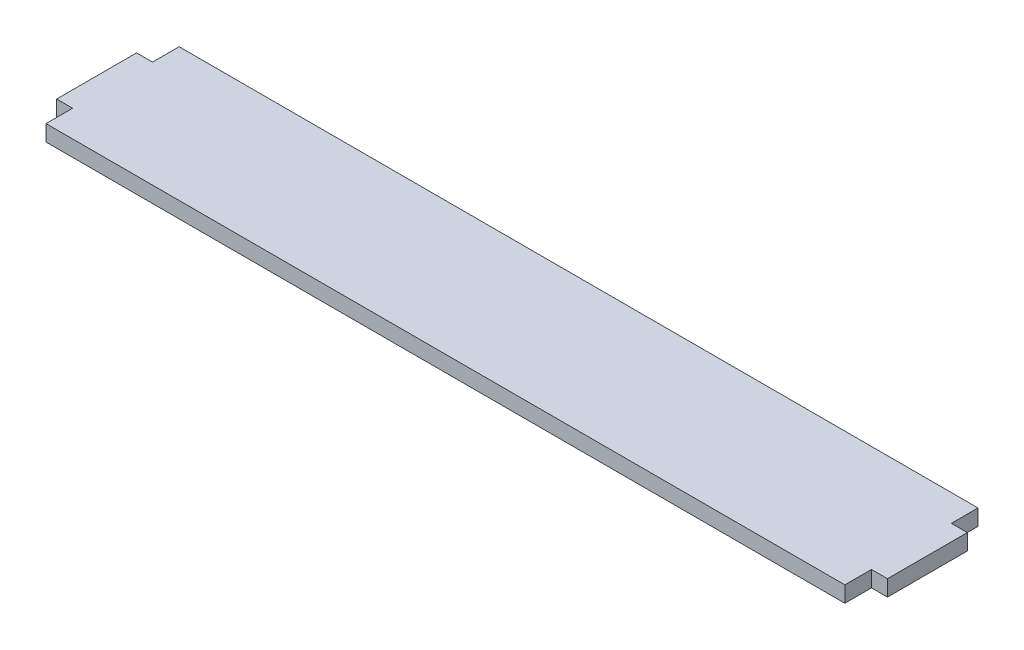
ISO-10303-21;
HEADER;
FILE_DESCRIPTION(('STEP AP214'),'2;1');
FILE_NAME('part.step','',(''),(''),'','','');
FILE_SCHEMA(('AUTOMOTIVE_DESIGN { 1 0 10303 214 1 1 1 1 }'));
ENDSEC;
DATA;
#1=APPLICATION_CONTEXT('core data for automotive mechanical design processes');
#2=APPLICATION_PROTOCOL_DEFINITION('international standard','automotive_design',2000,#1);
#3=PRODUCT_CONTEXT('',#1,'mechanical');
#4=PRODUCT('Part','Part','',(#3));
#5=PRODUCT_RELATED_PRODUCT_CATEGORY('part','',(#4));
#6=PRODUCT_DEFINITION_FORMATION('','',#4);
#7=PRODUCT_DEFINITION_CONTEXT('part definition',#1,'design');
#8=PRODUCT_DEFINITION('design','',#6,#7);
#9=PRODUCT_DEFINITION_SHAPE('','',#8);
#10=(LENGTH_UNIT() NAMED_UNIT(*) SI_UNIT(.MILLI.,.METRE.));
#11=(NAMED_UNIT(*) PLANE_ANGLE_UNIT() SI_UNIT($,.RADIAN.));
#12=(NAMED_UNIT(*) SI_UNIT($,.STERADIAN.) SOLID_ANGLE_UNIT());
#13=UNCERTAINTY_MEASURE_WITH_UNIT(LENGTH_MEASURE(1.E-05),#10,'distance_accuracy_value','');
#14=(GEOMETRIC_REPRESENTATION_CONTEXT(3) GLOBAL_UNCERTAINTY_ASSIGNED_CONTEXT((#13)) GLOBAL_UNIT_ASSIGNED_CONTEXT((#10,
#11,#12)) REPRESENTATION_CONTEXT('',''));
#15=CARTESIAN_POINT('',(0.,0.,0.));
#16=DIRECTION('',(0.,0.,1.));
#17=DIRECTION('',(1.,0.,0.));
#18=AXIS2_PLACEMENT_3D('',#15,#16,#17);
#19=CARTESIAN_POINT('',(150.,3.,-25.));
#20=DIRECTION('',(-1.,0.,0.));
#21=DIRECTION('',(0.,0.,1.));
#22=AXIS2_PLACEMENT_3D('',#19,#20,#21);
#23=PLANE('',#22);
#24=DIRECTION('',(0.,0.,-1.));
#25=VECTOR('',#24,1.);
#26=CARTESIAN_POINT('',(150.,0.,-25.));
#27=LINE('',#26,#25);
#28=CARTESIAN_POINT('',(150.,0.,-20.));
#29=VERTEX_POINT('',#28);
#30=CARTESIAN_POINT('',(150.,0.,-25.));
#31=VERTEX_POINT('',#30);
#32=EDGE_CURVE('E164',#29,#31,#27,.T.);
#33=ORIENTED_EDGE('',*,*,#32,.T.);
#34=DIRECTION('',(0.,-1.,0.));
#35=VECTOR('',#34,1.);
#36=CARTESIAN_POINT('',(150.,3.,-25.));
#37=LINE('',#36,#35);
#38=CARTESIAN_POINT('',(150.,3.,-25.));
#39=VERTEX_POINT('',#38);
#40=EDGE_CURVE('E11',#39,#31,#37,.T.);
#41=ORIENTED_EDGE('',*,*,#40,.F.);
#42=DIRECTION('',(0.,0.,-1.));
#43=VECTOR('',#42,1.);
#44=CARTESIAN_POINT('',(150.,3.,-25.));
#45=LINE('',#44,#43);
#46=CARTESIAN_POINT('',(150.,3.,-20.));
#47=VERTEX_POINT('',#46);
#48=EDGE_CURVE('E198',#47,#39,#45,.T.);
#49=ORIENTED_EDGE('',*,*,#48,.F.);
#50=DIRECTION('',(0.,-1.,0.));
#51=VECTOR('',#50,1.);
#52=CARTESIAN_POINT('',(150.,3.,-20.));
#53=LINE('',#52,#51);
#54=EDGE_CURVE('E160',#47,#29,#53,.T.);
#55=ORIENTED_EDGE('',*,*,#54,.T.);
#56=EDGE_LOOP('',(#33,#41,#49,#55));
#57=FACE_BOUND('',#56,.T.);
#58=ADVANCED_FACE('F39',(#57),#23,.F.);
#59=CARTESIAN_POINT('',(150.,3.,-25.));
#60=DIRECTION('',(0.,0.,1.));
#61=DIRECTION('',(1.,0.,0.));
#62=AXIS2_PLACEMENT_3D('',#59,#60,#61);
#63=PLANE('',#62);
#64=DIRECTION('',(-1.,0.,0.));
#65=VECTOR('',#64,1.);
#66=CARTESIAN_POINT('',(150.,0.,-25.));
#67=LINE('',#66,#65);
#68=CARTESIAN_POINT('',(0.,0.,-25.));
#69=VERTEX_POINT('',#68);
#70=EDGE_CURVE('E168',#31,#69,#67,.T.);
#71=ORIENTED_EDGE('',*,*,#70,.T.);
#72=DIRECTION('',(0.,-1.,0.));
#73=VECTOR('',#72,1.);
#74=CARTESIAN_POINT('',(0.,3.,-25.));
#75=LINE('',#74,#73);
#76=CARTESIAN_POINT('',(0.,3.,-25.));
#77=VERTEX_POINT('',#76);
#78=EDGE_CURVE('E48',#77,#69,#75,.T.);
#79=ORIENTED_EDGE('',*,*,#78,.F.);
#80=DIRECTION('',(-1.,0.,0.));
#81=VECTOR('',#80,1.);
#82=CARTESIAN_POINT('',(150.,3.,-25.));
#83=LINE('',#82,#81);
#84=EDGE_CURVE('E111',#39,#77,#83,.T.);
#85=ORIENTED_EDGE('',*,*,#84,.F.);
#86=ORIENTED_EDGE('',*,*,#40,.T.);
#87=EDGE_LOOP('',(#71,#79,#85,#86));
#88=FACE_BOUND('',#87,.T.);
#89=ADVANCED_FACE('F292',(#88),#63,.F.);
#90=CARTESIAN_POINT('',(0.,3.,-25.));
#91=DIRECTION('',(1.,0.,0.));
#92=DIRECTION('',(0.,0.,-1.));
#93=AXIS2_PLACEMENT_3D('',#90,#91,#92);
#94=PLANE('',#93);
#95=DIRECTION('',(0.,0.,1.));
#96=VECTOR('',#95,1.);
#97=CARTESIAN_POINT('',(0.,0.,-25.));
#98=LINE('',#97,#96);
#99=CARTESIAN_POINT('',(0.,0.,-20.));
#100=VERTEX_POINT('',#99);
#101=EDGE_CURVE('E171',#69,#100,#98,.T.);
#102=ORIENTED_EDGE('',*,*,#101,.T.);
#103=DIRECTION('',(0.,-1.,0.));
#104=VECTOR('',#103,1.);
#105=CARTESIAN_POINT('',(0.,3.,-20.));
#106=LINE('',#105,#104);
#107=CARTESIAN_POINT('',(0.,3.,-20.));
#108=VERTEX_POINT('',#107);
#109=EDGE_CURVE('E225',#108,#100,#106,.T.);
#110=ORIENTED_EDGE('',*,*,#109,.F.);
#111=DIRECTION('',(0.,0.,1.));
#112=VECTOR('',#111,1.);
#113=CARTESIAN_POINT('',(0.,3.,-25.));
#114=LINE('',#113,#112);
#115=EDGE_CURVE('E235',#77,#108,#114,.T.);
#116=ORIENTED_EDGE('',*,*,#115,.F.);
#117=ORIENTED_EDGE('',*,*,#78,.T.);
#118=EDGE_LOOP('',(#102,#110,#116,#117));
#119=FACE_BOUND('',#118,.T.);
#120=ADVANCED_FACE('F233',(#119),#94,.F.);
#121=CARTESIAN_POINT('',(0.,3.,-20.));
#122=DIRECTION('',(0.,0.,1.));
#123=DIRECTION('',(1.,0.,0.));
#124=AXIS2_PLACEMENT_3D('',#121,#122,#123);
#125=PLANE('',#124);
#126=DIRECTION('',(-1.,0.,0.));
#127=VECTOR('',#126,1.);
#128=CARTESIAN_POINT('',(0.,0.,-20.));
#129=LINE('',#128,#127);
#130=CARTESIAN_POINT('',(-3.,0.,-20.));
#131=VERTEX_POINT('',#130);
#132=EDGE_CURVE('E174',#100,#131,#129,.T.);
#133=ORIENTED_EDGE('',*,*,#132,.T.);
#134=DIRECTION('',(0.,-1.,0.));
#135=VECTOR('',#134,1.);
#136=CARTESIAN_POINT('',(-3.,3.,-20.));
#137=LINE('',#136,#135);
#138=CARTESIAN_POINT('',(-3.,3.,-20.));
#139=VERTEX_POINT('',#138);
#140=EDGE_CURVE('E221',#139,#131,#137,.T.);
#141=ORIENTED_EDGE('',*,*,#140,.F.);
#142=DIRECTION('',(-1.,0.,0.));
#143=VECTOR('',#142,1.);
#144=CARTESIAN_POINT('',(0.,3.,-20.));
#145=LINE('',#144,#143);
#146=EDGE_CURVE('E254',#108,#139,#145,.T.);
#147=ORIENTED_EDGE('',*,*,#146,.F.);
#148=ORIENTED_EDGE('',*,*,#109,.T.);
#149=EDGE_LOOP('',(#133,#141,#147,#148));
#150=FACE_BOUND('',#149,.T.);
#151=ADVANCED_FACE('F244',(#150),#125,.F.);
#152=CARTESIAN_POINT('',(-3.,3.,-20.));
#153=DIRECTION('',(1.,0.,0.));
#154=DIRECTION('',(0.,0.,-1.));
#155=AXIS2_PLACEMENT_3D('',#152,#153,#154);
#156=PLANE('',#155);
#157=DIRECTION('',(0.,0.,1.));
#158=VECTOR('',#157,1.);
#159=CARTESIAN_POINT('',(-3.,0.,-20.));
#160=LINE('',#159,#158);
#161=CARTESIAN_POINT('',(-3.,0.,-5.));
#162=VERTEX_POINT('',#161);
#163=EDGE_CURVE('E177',#131,#162,#160,.T.);
#164=ORIENTED_EDGE('',*,*,#163,.T.);
#165=DIRECTION('',(0.,-1.,0.));
#166=VECTOR('',#165,1.);
#167=CARTESIAN_POINT('',(-3.,3.,-5.));
#168=LINE('',#167,#166);
#169=CARTESIAN_POINT('',(-3.,3.,-5.));
#170=VERTEX_POINT('',#169);
#171=EDGE_CURVE('E217',#170,#162,#168,.T.);
#172=ORIENTED_EDGE('',*,*,#171,.F.);
#173=DIRECTION('',(0.,0.,1.));
#174=VECTOR('',#173,1.);
#175=CARTESIAN_POINT('',(-3.,3.,-20.));
#176=LINE('',#175,#174);
#177=EDGE_CURVE('E250',#139,#170,#176,.T.);
#178=ORIENTED_EDGE('',*,*,#177,.F.);
#179=ORIENTED_EDGE('',*,*,#140,.T.);
#180=EDGE_LOOP('',(#164,#172,#178,#179));
#181=FACE_BOUND('',#180,.T.);
#182=ADVANCED_FACE('F248',(#181),#156,.F.);
#183=CARTESIAN_POINT('',(0.,3.,-5.));
#184=DIRECTION('',(0.,0.,-1.));
#185=DIRECTION('',(-1.,0.,0.));
#186=AXIS2_PLACEMENT_3D('',#183,#184,#185);
#187=PLANE('',#186);
#188=DIRECTION('',(1.,0.,0.));
#189=VECTOR('',#188,1.);
#190=CARTESIAN_POINT('',(0.,0.,-5.));
#191=LINE('',#190,#189);
#192=CARTESIAN_POINT('',(0.,0.,-5.));
#193=VERTEX_POINT('',#192);
#194=EDGE_CURVE('E180',#162,#193,#191,.T.);
#195=ORIENTED_EDGE('',*,*,#194,.T.);
#196=DIRECTION('',(0.,-1.,0.));
#197=VECTOR('',#196,1.);
#198=CARTESIAN_POINT('',(0.,3.,-5.));
#199=LINE('',#198,#197);
#200=CARTESIAN_POINT('',(0.,3.,-5.));
#201=VERTEX_POINT('',#200);
#202=EDGE_CURVE('E213',#201,#193,#199,.T.);
#203=ORIENTED_EDGE('',*,*,#202,.F.);
#204=DIRECTION('',(1.,0.,0.));
#205=VECTOR('',#204,1.);
#206=CARTESIAN_POINT('',(0.,3.,-5.));
#207=LINE('',#206,#205);
#208=EDGE_CURVE('E253',#170,#201,#207,.T.);
#209=ORIENTED_EDGE('',*,*,#208,.F.);
#210=ORIENTED_EDGE('',*,*,#171,.T.);
#211=EDGE_LOOP('',(#195,#203,#209,#210));
#212=FACE_BOUND('',#211,.T.);
#213=ADVANCED_FACE('F305',(#212),#187,.F.);
#214=CARTESIAN_POINT('',(0.,3.,-5.));
#215=DIRECTION('',(1.,0.,0.));
#216=DIRECTION('',(0.,0.,-1.));
#217=AXIS2_PLACEMENT_3D('',#214,#215,#216);
#218=PLANE('',#217);
#219=DIRECTION('',(0.,0.,1.));
#220=VECTOR('',#219,1.);
#221=CARTESIAN_POINT('',(0.,0.,-5.));
#222=LINE('',#221,#220);
#223=CARTESIAN_POINT('',(0.,0.,0.));
#224=VERTEX_POINT('',#223);
#225=EDGE_CURVE('E183',#193,#224,#222,.T.);
#226=ORIENTED_EDGE('',*,*,#225,.T.);
#227=DIRECTION('',(0.,-1.,0.));
#228=VECTOR('',#227,1.);
#229=CARTESIAN_POINT('',(0.,3.,0.));
#230=LINE('',#229,#228);
#231=CARTESIAN_POINT('',(0.,3.,0.));
#232=VERTEX_POINT('',#231);
#233=EDGE_CURVE('E209',#232,#224,#230,.T.);
#234=ORIENTED_EDGE('',*,*,#233,.F.);
#235=DIRECTION('',(0.,0.,1.));
#236=VECTOR('',#235,1.);
#237=CARTESIAN_POINT('',(0.,3.,-5.));
#238=LINE('',#237,#236);
#239=EDGE_CURVE('E258',#201,#232,#238,.T.);
#240=ORIENTED_EDGE('',*,*,#239,.F.);
#241=ORIENTED_EDGE('',*,*,#202,.T.);
#242=EDGE_LOOP('',(#226,#234,#240,#241));
#243=FACE_BOUND('',#242,.T.);
#244=ADVANCED_FACE('F308',(#243),#218,.F.);
#245=CARTESIAN_POINT('',(150.,3.,0.));
#246=DIRECTION('',(0.,0.,-1.));
#247=DIRECTION('',(-1.,0.,0.));
#248=AXIS2_PLACEMENT_3D('',#245,#246,#247);
#249=PLANE('',#248);
#250=DIRECTION('',(1.,0.,0.));
#251=VECTOR('',#250,1.);
#252=CARTESIAN_POINT('',(150.,0.,0.));
#253=LINE('',#252,#251);
#254=CARTESIAN_POINT('',(150.,0.,0.));
#255=VERTEX_POINT('',#254);
#256=EDGE_CURVE('E186',#224,#255,#253,.T.);
#257=ORIENTED_EDGE('',*,*,#256,.T.);
#258=DIRECTION('',(0.,-1.,0.));
#259=VECTOR('',#258,1.);
#260=CARTESIAN_POINT('',(150.,3.,0.));
#261=LINE('',#260,#259);
#262=CARTESIAN_POINT('',(150.,3.,0.));
#263=VERTEX_POINT('',#262);
#264=EDGE_CURVE('E205',#263,#255,#261,.T.);
#265=ORIENTED_EDGE('',*,*,#264,.F.);
#266=DIRECTION('',(1.,0.,0.));
#267=VECTOR('',#266,1.);
#268=CARTESIAN_POINT('',(150.,3.,0.));
#269=LINE('',#268,#267);
#270=EDGE_CURVE('E265',#232,#263,#269,.T.);
#271=ORIENTED_EDGE('',*,*,#270,.F.);
#272=ORIENTED_EDGE('',*,*,#233,.T.);
#273=EDGE_LOOP('',(#257,#265,#271,#272));
#274=FACE_BOUND('',#273,.T.);
#275=ADVANCED_FACE('F273',(#274),#249,.F.);
#276=CARTESIAN_POINT('',(150.,3.,-5.00000000000002));
#277=DIRECTION('',(-1.,0.,0.));
#278=DIRECTION('',(0.,0.,1.));
#279=AXIS2_PLACEMENT_3D('',#276,#277,#278);
#280=PLANE('',#279);
#281=DIRECTION('',(0.,0.,-1.));
#282=VECTOR('',#281,1.);
#283=CARTESIAN_POINT('',(150.,0.,-5.00000000000002));
#284=LINE('',#283,#282);
#285=CARTESIAN_POINT('',(150.,0.,-5.00000000000002));
#286=VERTEX_POINT('',#285);
#287=EDGE_CURVE('E189',#255,#286,#284,.T.);
#288=ORIENTED_EDGE('',*,*,#287,.T.);
#289=DIRECTION('',(0.,-1.,0.));
#290=VECTOR('',#289,1.);
#291=CARTESIAN_POINT('',(150.,3.,-5.00000000000002));
#292=LINE('',#291,#290);
#293=CARTESIAN_POINT('',(150.,3.,-5.00000000000002));
#294=VERTEX_POINT('',#293);
#295=EDGE_CURVE('E153',#294,#286,#292,.T.);
#296=ORIENTED_EDGE('',*,*,#295,.F.);
#297=DIRECTION('',(0.,0.,-1.));
#298=VECTOR('',#297,1.);
#299=CARTESIAN_POINT('',(150.,3.,-5.00000000000002));
#300=LINE('',#299,#298);
#301=EDGE_CURVE('E142',#263,#294,#300,.T.);
#302=ORIENTED_EDGE('',*,*,#301,.F.);
#303=ORIENTED_EDGE('',*,*,#264,.T.);
#304=EDGE_LOOP('',(#288,#296,#302,#303));
#305=FACE_BOUND('',#304,.T.);
#306=ADVANCED_FACE('F277',(#305),#280,.F.);
#307=CARTESIAN_POINT('',(150.,3.,-5.00000000000002));
#308=DIRECTION('',(0.,0.,-1.));
#309=DIRECTION('',(-1.,0.,0.));
#310=AXIS2_PLACEMENT_3D('',#307,#308,#309);
#311=PLANE('',#310);
#312=DIRECTION('',(1.,0.,0.));
#313=VECTOR('',#312,1.);
#314=CARTESIAN_POINT('',(150.,0.,-5.00000000000002));
#315=LINE('',#314,#313);
#316=CARTESIAN_POINT('',(153.,0.,-5.00000000000002));
#317=VERTEX_POINT('',#316);
#318=EDGE_CURVE('E151',#286,#317,#315,.T.);
#319=ORIENTED_EDGE('',*,*,#318,.T.);
#320=DIRECTION('',(0.,-1.,0.));
#321=VECTOR('',#320,1.);
#322=CARTESIAN_POINT('',(153.,3.,-5.00000000000002));
#323=LINE('',#322,#321);
#324=CARTESIAN_POINT('',(153.,3.,-5.00000000000002));
#325=VERTEX_POINT('',#324);
#326=EDGE_CURVE('E148',#325,#317,#323,.T.);
#327=ORIENTED_EDGE('',*,*,#326,.F.);
#328=DIRECTION('',(1.,0.,0.));
#329=VECTOR('',#328,1.);
#330=CARTESIAN_POINT('',(150.,3.,-5.00000000000002));
#331=LINE('',#330,#329);
#332=EDGE_CURVE('E136',#294,#325,#331,.T.);
#333=ORIENTED_EDGE('',*,*,#332,.F.);
#334=ORIENTED_EDGE('',*,*,#295,.T.);
#335=EDGE_LOOP('',(#319,#327,#333,#334));
#336=FACE_BOUND('',#335,.T.);
#337=ADVANCED_FACE('F149',(#336),#311,.F.);
#338=CARTESIAN_POINT('',(153.,3.,-20.));
#339=DIRECTION('',(-1.,0.,0.));
#340=DIRECTION('',(0.,0.,1.));
#341=AXIS2_PLACEMENT_3D('',#338,#339,#340);
#342=PLANE('',#341);
#343=DIRECTION('',(0.,0.,-1.));
#344=VECTOR('',#343,1.);
#345=CARTESIAN_POINT('',(153.,0.,-20.));
#346=LINE('',#345,#344);
#347=CARTESIAN_POINT('',(153.,0.,-20.));
#348=VERTEX_POINT('',#347);
#349=EDGE_CURVE('E97',#317,#348,#346,.T.);
#350=ORIENTED_EDGE('',*,*,#349,.T.);
#351=DIRECTION('',(0.,-1.,0.));
#352=VECTOR('',#351,1.);
#353=CARTESIAN_POINT('',(153.,3.,-20.));
#354=LINE('',#353,#352);
#355=CARTESIAN_POINT('',(153.,3.,-20.));
#356=VERTEX_POINT('',#355);
#357=EDGE_CURVE('E154',#356,#348,#354,.T.);
#358=ORIENTED_EDGE('',*,*,#357,.F.);
#359=DIRECTION('',(0.,0.,-1.));
#360=VECTOR('',#359,1.);
#361=CARTESIAN_POINT('',(153.,3.,-20.));
#362=LINE('',#361,#360);
#363=EDGE_CURVE('E140',#325,#356,#362,.T.);
#364=ORIENTED_EDGE('',*,*,#363,.F.);
#365=ORIENTED_EDGE('',*,*,#326,.T.);
#366=EDGE_LOOP('',(#350,#358,#364,#365));
#367=FACE_BOUND('',#366,.T.);
#368=ADVANCED_FACE('F156',(#367),#342,.F.);
#369=CARTESIAN_POINT('',(150.,3.,-20.));
#370=DIRECTION('',(0.,0.,1.));
#371=DIRECTION('',(1.,0.,0.));
#372=AXIS2_PLACEMENT_3D('',#369,#370,#371);
#373=PLANE('',#372);
#374=DIRECTION('',(-1.,0.,0.));
#375=VECTOR('',#374,1.);
#376=CARTESIAN_POINT('',(150.,0.,-20.));
#377=LINE('',#376,#375);
#378=EDGE_CURVE('E103',#348,#29,#377,.T.);
#379=ORIENTED_EDGE('',*,*,#378,.T.);
#380=ORIENTED_EDGE('',*,*,#54,.F.);
#381=DIRECTION('',(-1.,0.,0.));
#382=VECTOR('',#381,1.);
#383=CARTESIAN_POINT('',(150.,3.,-20.));
#384=LINE('',#383,#382);
#385=EDGE_CURVE('E56',#356,#47,#384,.T.);
#386=ORIENTED_EDGE('',*,*,#385,.F.);
#387=ORIENTED_EDGE('',*,*,#357,.T.);
#388=EDGE_LOOP('',(#379,#380,#386,#387));
#389=FACE_BOUND('',#388,.T.);
#390=ADVANCED_FACE('F281',(#389),#373,.F.);
#391=CARTESIAN_POINT('',(0.,3.,0.));
#392=DIRECTION('',(0.,1.,0.));
#393=DIRECTION('',(0.,0.,1.));
#394=AXIS2_PLACEMENT_3D('',#391,#392,#393);
#395=PLANE('',#394);
#396=ORIENTED_EDGE('',*,*,#48,.T.);
#397=ORIENTED_EDGE('',*,*,#84,.T.);
#398=ORIENTED_EDGE('',*,*,#115,.T.);
#399=ORIENTED_EDGE('',*,*,#146,.T.);
#400=ORIENTED_EDGE('',*,*,#177,.T.);
#401=ORIENTED_EDGE('',*,*,#208,.T.);
#402=ORIENTED_EDGE('',*,*,#239,.T.);
#403=ORIENTED_EDGE('',*,*,#270,.T.);
#404=ORIENTED_EDGE('',*,*,#301,.T.);
#405=ORIENTED_EDGE('',*,*,#332,.T.);
#406=ORIENTED_EDGE('',*,*,#363,.T.);
#407=ORIENTED_EDGE('',*,*,#385,.T.);
#408=EDGE_LOOP('',(#396,#397,#398,#399,#400,#401,#402,#403,#404,#405,#406,#407));
#409=FACE_BOUND('',#408,.T.);
#410=ADVANCED_FACE('F138',(#409),#395,.T.);
#411=CARTESIAN_POINT('',(0.,0.,0.));
#412=DIRECTION('',(0.,1.,0.));
#413=DIRECTION('',(0.,0.,1.));
#414=AXIS2_PLACEMENT_3D('',#411,#412,#413);
#415=PLANE('',#414);
#416=ORIENTED_EDGE('',*,*,#32,.F.);
#417=ORIENTED_EDGE('',*,*,#378,.F.);
#418=ORIENTED_EDGE('',*,*,#349,.F.);
#419=ORIENTED_EDGE('',*,*,#318,.F.);
#420=ORIENTED_EDGE('',*,*,#287,.F.);
#421=ORIENTED_EDGE('',*,*,#256,.F.);
#422=ORIENTED_EDGE('',*,*,#225,.F.);
#423=ORIENTED_EDGE('',*,*,#194,.F.);
#424=ORIENTED_EDGE('',*,*,#163,.F.);
#425=ORIENTED_EDGE('',*,*,#132,.F.);
#426=ORIENTED_EDGE('',*,*,#101,.F.);
#427=ORIENTED_EDGE('',*,*,#70,.F.);
#428=EDGE_LOOP('',(#416,#417,#418,#419,#420,#421,#422,#423,#424,#425,#426,#427));
#429=FACE_BOUND('',#428,.T.);
#430=ADVANCED_FACE('F239',(#429),#415,.F.);
#431=CLOSED_SHELL('',(#58,#89,#120,#151,#182,#213,#244,#275,#306,#337,#368,#390,#410,#430));
#432=MANIFOLD_SOLID_BREP('B2',#431);
#433=ADVANCED_BREP_SHAPE_REPRESENTATION('',(#18,#432),#14);
#434=SHAPE_DEFINITION_REPRESENTATION(#9,#433);
ENDSEC;
END-ISO-10303-21;
